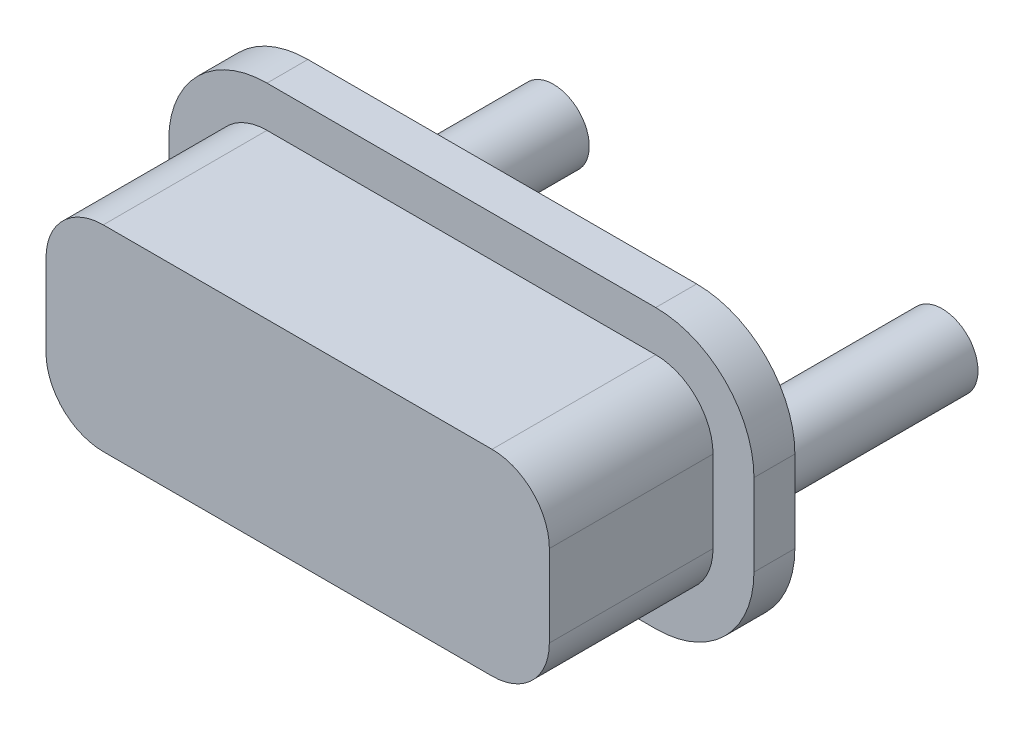
ISO-10303-21;
HEADER;
FILE_DESCRIPTION(('STEP AP214'),'2;1');
FILE_NAME('part.step','',(''),(''),'','','');
FILE_SCHEMA(('AUTOMOTIVE_DESIGN { 1 0 10303 214 1 1 1 1 }'));
ENDSEC;
DATA;
#1=APPLICATION_CONTEXT('core data for automotive mechanical design processes');
#2=APPLICATION_PROTOCOL_DEFINITION('international standard','automotive_design',2000,#1);
#3=PRODUCT_CONTEXT('',#1,'mechanical');
#4=PRODUCT('Part','Part','',(#3));
#5=PRODUCT_RELATED_PRODUCT_CATEGORY('part','',(#4));
#6=PRODUCT_DEFINITION_FORMATION('','',#4);
#7=PRODUCT_DEFINITION_CONTEXT('part definition',#1,'design');
#8=PRODUCT_DEFINITION('design','',#6,#7);
#9=PRODUCT_DEFINITION_SHAPE('','',#8);
#10=(LENGTH_UNIT() NAMED_UNIT(*) SI_UNIT(.MILLI.,.METRE.));
#11=(NAMED_UNIT(*) PLANE_ANGLE_UNIT() SI_UNIT($,.RADIAN.));
#12=(NAMED_UNIT(*) SI_UNIT($,.STERADIAN.) SOLID_ANGLE_UNIT());
#13=UNCERTAINTY_MEASURE_WITH_UNIT(LENGTH_MEASURE(1.E-05),#10,'distance_accuracy_value','');
#14=(GEOMETRIC_REPRESENTATION_CONTEXT(3) GLOBAL_UNCERTAINTY_ASSIGNED_CONTEXT((#13)) GLOBAL_UNIT_ASSIGNED_CONTEXT((#10,
#11,#12)) REPRESENTATION_CONTEXT('',''));
#15=CARTESIAN_POINT('',(0.,0.,0.));
#16=DIRECTION('',(0.,0.,1.));
#17=DIRECTION('',(1.,0.,0.));
#18=AXIS2_PLACEMENT_3D('',#15,#16,#17);
#19=CARTESIAN_POINT('',(9.49999999999998,57.365,-10.));
#20=DIRECTION('',(0.,0.,1.));
#21=DIRECTION('',(1.,0.,0.));
#22=AXIS2_PLACEMENT_3D('',#19,#20,#21);
#23=CYLINDRICAL_SURFACE('',#22,2.8);
#24=CARTESIAN_POINT('',(9.49999999999998,57.365,-8.));
#25=DIRECTION('',(0.,0.,1.));
#26=DIRECTION('',(1.,0.,0.));
#27=AXIS2_PLACEMENT_3D('',#24,#25,#26);
#28=CIRCLE('',#27,2.8);
#29=CARTESIAN_POINT('',(12.3,57.365,-8.));
#30=VERTEX_POINT('',#29);
#31=CARTESIAN_POINT('',(9.49999999999998,54.565,-8.));
#32=VERTEX_POINT('',#31);
#33=EDGE_CURVE('E200',#30,#32,#28,.F.);
#34=ORIENTED_EDGE('',*,*,#33,.F.);
#35=DIRECTION('',(0.,0.,1.));
#36=VECTOR('',#35,1.);
#37=CARTESIAN_POINT('',(12.3,57.365,-10.));
#38=LINE('',#37,#36);
#39=CARTESIAN_POINT('',(12.3,57.365,0.));
#40=VERTEX_POINT('',#39);
#41=EDGE_CURVE('E227',#30,#40,#38,.T.);
#42=ORIENTED_EDGE('',*,*,#41,.T.);
#43=CARTESIAN_POINT('',(9.49999999999998,57.365,0.));
#44=DIRECTION('',(0.,0.,1.));
#45=DIRECTION('',(1.,0.,0.));
#46=AXIS2_PLACEMENT_3D('',#43,#44,#45);
#47=CIRCLE('',#46,2.8);
#48=CARTESIAN_POINT('',(9.49999999999998,54.565,0.));
#49=VERTEX_POINT('',#48);
#50=EDGE_CURVE('E203',#49,#40,#47,.T.);
#51=ORIENTED_EDGE('',*,*,#50,.F.);
#52=DIRECTION('',(0.,0.,1.));
#53=VECTOR('',#52,1.);
#54=CARTESIAN_POINT('',(9.49999999999998,54.565,-10.));
#55=LINE('',#54,#53);
#56=EDGE_CURVE('E228',#32,#49,#55,.T.);
#57=ORIENTED_EDGE('',*,*,#56,.F.);
#58=EDGE_LOOP('',(#34,#42,#51,#57));
#59=FACE_BOUND('',#58,.T.);
#60=ADVANCED_FACE('F41',(#59),#23,.T.);
#61=CARTESIAN_POINT('',(-9.50000000000003,54.565,-10.));
#62=DIRECTION('',(0.,-1.,0.));
#63=DIRECTION('',(0.,0.,-1.));
#64=AXIS2_PLACEMENT_3D('',#61,#62,#63);
#65=PLANE('',#64);
#66=DIRECTION('',(-1.,0.,0.));
#67=VECTOR('',#66,1.);
#68=CARTESIAN_POINT('',(-9.50000000000003,54.565,-8.));
#69=LINE('',#68,#67);
#70=CARTESIAN_POINT('',(-9.50000000000003,54.565,-8.));
#71=VERTEX_POINT('',#70);
#72=EDGE_CURVE('E57',#32,#71,#69,.T.);
#73=ORIENTED_EDGE('',*,*,#72,.F.);
#74=ORIENTED_EDGE('',*,*,#56,.T.);
#75=DIRECTION('',(1.,0.,0.));
#76=VECTOR('',#75,1.);
#77=CARTESIAN_POINT('',(-9.50000000000003,54.565,0.));
#78=LINE('',#77,#76);
#79=CARTESIAN_POINT('',(-9.50000000000003,54.565,0.));
#80=VERTEX_POINT('',#79);
#81=EDGE_CURVE('E224',#80,#49,#78,.T.);
#82=ORIENTED_EDGE('',*,*,#81,.F.);
#83=DIRECTION('',(0.,0.,1.));
#84=VECTOR('',#83,1.);
#85=CARTESIAN_POINT('',(-9.50000000000003,54.565,-10.));
#86=LINE('',#85,#84);
#87=EDGE_CURVE('E231',#71,#80,#86,.T.);
#88=ORIENTED_EDGE('',*,*,#87,.F.);
#89=EDGE_LOOP('',(#73,#74,#82,#88));
#90=FACE_BOUND('',#89,.T.);
#91=ADVANCED_FACE('F353',(#90),#65,.T.);
#92=CARTESIAN_POINT('',(-9.50000000000003,57.365,-10.));
#93=DIRECTION('',(0.,0.,1.));
#94=DIRECTION('',(1.,0.,0.));
#95=AXIS2_PLACEMENT_3D('',#92,#93,#94);
#96=CYLINDRICAL_SURFACE('',#95,2.8);
#97=CARTESIAN_POINT('',(-9.50000000000003,57.365,-8.));
#98=DIRECTION('',(0.,0.,1.));
#99=DIRECTION('',(1.,0.,0.));
#100=AXIS2_PLACEMENT_3D('',#97,#98,#99);
#101=CIRCLE('',#100,2.8);
#102=CARTESIAN_POINT('',(-12.3,57.365,-8.));
#103=VERTEX_POINT('',#102);
#104=EDGE_CURVE('E65',#71,#103,#101,.F.);
#105=ORIENTED_EDGE('',*,*,#104,.F.);
#106=ORIENTED_EDGE('',*,*,#87,.T.);
#107=CARTESIAN_POINT('',(-9.50000000000003,57.365,0.));
#108=DIRECTION('',(0.,0.,1.));
#109=DIRECTION('',(1.,0.,0.));
#110=AXIS2_PLACEMENT_3D('',#107,#108,#109);
#111=CIRCLE('',#110,2.8);
#112=CARTESIAN_POINT('',(-12.3,57.365,0.));
#113=VERTEX_POINT('',#112);
#114=EDGE_CURVE('E221',#113,#80,#111,.T.);
#115=ORIENTED_EDGE('',*,*,#114,.F.);
#116=DIRECTION('',(0.,0.,1.));
#117=VECTOR('',#116,1.);
#118=CARTESIAN_POINT('',(-12.3,57.365,-10.));
#119=LINE('',#118,#117);
#120=EDGE_CURVE('E233',#103,#113,#119,.T.);
#121=ORIENTED_EDGE('',*,*,#120,.F.);
#122=EDGE_LOOP('',(#105,#106,#115,#121));
#123=FACE_BOUND('',#122,.T.);
#124=ADVANCED_FACE('F360',(#123),#96,.T.);
#125=CARTESIAN_POINT('',(-12.3,61.365,-10.));
#126=DIRECTION('',(-1.,0.,0.));
#127=DIRECTION('',(0.,0.,1.));
#128=AXIS2_PLACEMENT_3D('',#125,#126,#127);
#129=PLANE('',#128);
#130=DIRECTION('',(0.,1.,0.));
#131=VECTOR('',#130,1.);
#132=CARTESIAN_POINT('',(-12.3,61.365,-8.));
#133=LINE('',#132,#131);
#134=CARTESIAN_POINT('',(-12.3,61.365,-8.));
#135=VERTEX_POINT('',#134);
#136=EDGE_CURVE('E195',#103,#135,#133,.T.);
#137=ORIENTED_EDGE('',*,*,#136,.F.);
#138=ORIENTED_EDGE('',*,*,#120,.T.);
#139=DIRECTION('',(0.,-1.,0.));
#140=VECTOR('',#139,1.);
#141=CARTESIAN_POINT('',(-12.3,61.365,0.));
#142=LINE('',#141,#140);
#143=CARTESIAN_POINT('',(-12.3,61.365,0.));
#144=VERTEX_POINT('',#143);
#145=EDGE_CURVE('E218',#144,#113,#142,.T.);
#146=ORIENTED_EDGE('',*,*,#145,.F.);
#147=DIRECTION('',(0.,0.,1.));
#148=VECTOR('',#147,1.);
#149=CARTESIAN_POINT('',(-12.3,61.365,-10.));
#150=LINE('',#149,#148);
#151=EDGE_CURVE('E235',#135,#144,#150,.T.);
#152=ORIENTED_EDGE('',*,*,#151,.F.);
#153=EDGE_LOOP('',(#137,#138,#146,#152));
#154=FACE_BOUND('',#153,.T.);
#155=ADVANCED_FACE('F385',(#154),#129,.T.);
#156=CARTESIAN_POINT('',(-9.50000000000003,61.365,-10.));
#157=DIRECTION('',(0.,0.,1.));
#158=DIRECTION('',(1.,0.,0.));
#159=AXIS2_PLACEMENT_3D('',#156,#157,#158);
#160=CYLINDRICAL_SURFACE('',#159,2.8);
#161=CARTESIAN_POINT('',(-9.50000000000003,61.365,-8.));
#162=DIRECTION('',(0.,0.,1.));
#163=DIRECTION('',(1.,0.,0.));
#164=AXIS2_PLACEMENT_3D('',#161,#162,#163);
#165=CIRCLE('',#164,2.8);
#166=CARTESIAN_POINT('',(-9.50000000000003,64.165,-8.));
#167=VERTEX_POINT('',#166);
#168=EDGE_CURVE('E192',#135,#167,#165,.F.);
#169=ORIENTED_EDGE('',*,*,#168,.F.);
#170=ORIENTED_EDGE('',*,*,#151,.T.);
#171=CARTESIAN_POINT('',(-9.50000000000003,61.365,0.));
#172=DIRECTION('',(0.,0.,1.));
#173=DIRECTION('',(1.,0.,0.));
#174=AXIS2_PLACEMENT_3D('',#171,#172,#173);
#175=CIRCLE('',#174,2.8);
#176=CARTESIAN_POINT('',(-9.50000000000003,64.165,0.));
#177=VERTEX_POINT('',#176);
#178=EDGE_CURVE('E215',#177,#144,#175,.T.);
#179=ORIENTED_EDGE('',*,*,#178,.F.);
#180=DIRECTION('',(0.,0.,1.));
#181=VECTOR('',#180,1.);
#182=CARTESIAN_POINT('',(-9.50000000000003,64.165,-10.));
#183=LINE('',#182,#181);
#184=EDGE_CURVE('E237',#167,#177,#183,.T.);
#185=ORIENTED_EDGE('',*,*,#184,.F.);
#186=EDGE_LOOP('',(#169,#170,#179,#185));
#187=FACE_BOUND('',#186,.T.);
#188=ADVANCED_FACE('F381',(#187),#160,.T.);
#189=CARTESIAN_POINT('',(9.49999999999997,64.165,-10.));
#190=DIRECTION('',(0.,1.,0.));
#191=DIRECTION('',(0.,0.,1.));
#192=AXIS2_PLACEMENT_3D('',#189,#190,#191);
#193=PLANE('',#192);
#194=DIRECTION('',(1.,0.,0.));
#195=VECTOR('',#194,1.);
#196=CARTESIAN_POINT('',(9.49999999999997,64.165,-8.));
#197=LINE('',#196,#195);
#198=CARTESIAN_POINT('',(9.49999999999997,64.165,-8.));
#199=VERTEX_POINT('',#198);
#200=EDGE_CURVE('E184',#167,#199,#197,.T.);
#201=ORIENTED_EDGE('',*,*,#200,.F.);
#202=ORIENTED_EDGE('',*,*,#184,.T.);
#203=DIRECTION('',(-1.,0.,0.));
#204=VECTOR('',#203,1.);
#205=CARTESIAN_POINT('',(9.49999999999997,64.165,0.));
#206=LINE('',#205,#204);
#207=CARTESIAN_POINT('',(9.49999999999997,64.165,0.));
#208=VERTEX_POINT('',#207);
#209=EDGE_CURVE('E212',#208,#177,#206,.T.);
#210=ORIENTED_EDGE('',*,*,#209,.F.);
#211=DIRECTION('',(0.,0.,1.));
#212=VECTOR('',#211,1.);
#213=CARTESIAN_POINT('',(9.49999999999997,64.165,-10.));
#214=LINE('',#213,#212);
#215=EDGE_CURVE('E239',#199,#208,#214,.T.);
#216=ORIENTED_EDGE('',*,*,#215,.F.);
#217=EDGE_LOOP('',(#201,#202,#210,#216));
#218=FACE_BOUND('',#217,.T.);
#219=ADVANCED_FACE('F377',(#218),#193,.T.);
#220=CARTESIAN_POINT('',(9.49999999999998,61.365,-10.));
#221=DIRECTION('',(0.,0.,1.));
#222=DIRECTION('',(1.,0.,0.));
#223=AXIS2_PLACEMENT_3D('',#220,#221,#222);
#224=CYLINDRICAL_SURFACE('',#223,2.8);
#225=CARTESIAN_POINT('',(9.49999999999998,61.365,-8.));
#226=DIRECTION('',(0.,0.,1.));
#227=DIRECTION('',(1.,0.,0.));
#228=AXIS2_PLACEMENT_3D('',#225,#226,#227);
#229=CIRCLE('',#228,2.8);
#230=CARTESIAN_POINT('',(12.3,61.365,-8.));
#231=VERTEX_POINT('',#230);
#232=EDGE_CURVE('E181',#199,#231,#229,.F.);
#233=ORIENTED_EDGE('',*,*,#232,.F.);
#234=ORIENTED_EDGE('',*,*,#215,.T.);
#235=CARTESIAN_POINT('',(9.49999999999998,61.365,0.));
#236=DIRECTION('',(0.,0.,1.));
#237=DIRECTION('',(1.,0.,0.));
#238=AXIS2_PLACEMENT_3D('',#235,#236,#237);
#239=CIRCLE('',#238,2.8);
#240=CARTESIAN_POINT('',(12.3,61.365,0.));
#241=VERTEX_POINT('',#240);
#242=EDGE_CURVE('E209',#241,#208,#239,.T.);
#243=ORIENTED_EDGE('',*,*,#242,.F.);
#244=DIRECTION('',(0.,0.,1.));
#245=VECTOR('',#244,1.);
#246=CARTESIAN_POINT('',(12.3,61.365,-10.));
#247=LINE('',#246,#245);
#248=EDGE_CURVE('E241',#231,#241,#247,.T.);
#249=ORIENTED_EDGE('',*,*,#248,.F.);
#250=EDGE_LOOP('',(#233,#234,#243,#249));
#251=FACE_BOUND('',#250,.T.);
#252=ADVANCED_FACE('F373',(#251),#224,.T.);
#253=CARTESIAN_POINT('',(12.3,57.365,-10.));
#254=DIRECTION('',(1.,0.,0.));
#255=DIRECTION('',(0.,0.,-1.));
#256=AXIS2_PLACEMENT_3D('',#253,#254,#255);
#257=PLANE('',#256);
#258=DIRECTION('',(0.,-1.,0.));
#259=VECTOR('',#258,1.);
#260=CARTESIAN_POINT('',(12.3,57.365,-8.));
#261=LINE('',#260,#259);
#262=EDGE_CURVE('E230',#231,#30,#261,.T.);
#263=ORIENTED_EDGE('',*,*,#262,.F.);
#264=ORIENTED_EDGE('',*,*,#248,.T.);
#265=DIRECTION('',(0.,1.,0.));
#266=VECTOR('',#265,1.);
#267=CARTESIAN_POINT('',(12.3,57.365,0.));
#268=LINE('',#267,#266);
#269=EDGE_CURVE('E206',#40,#241,#268,.T.);
#270=ORIENTED_EDGE('',*,*,#269,.F.);
#271=ORIENTED_EDGE('',*,*,#41,.F.);
#272=EDGE_LOOP('',(#263,#264,#270,#271));
#273=FACE_BOUND('',#272,.T.);
#274=ADVANCED_FACE('F364',(#273),#257,.T.);
#275=CARTESIAN_POINT('',(9.49999999999998,57.365,0.));
#276=DIRECTION('',(0.,0.,1.));
#277=DIRECTION('',(1.,0.,0.));
#278=AXIS2_PLACEMENT_3D('',#275,#276,#277);
#279=PLANE('',#278);
#280=ORIENTED_EDGE('',*,*,#50,.T.);
#281=ORIENTED_EDGE('',*,*,#269,.T.);
#282=ORIENTED_EDGE('',*,*,#242,.T.);
#283=ORIENTED_EDGE('',*,*,#209,.T.);
#284=ORIENTED_EDGE('',*,*,#178,.T.);
#285=ORIENTED_EDGE('',*,*,#145,.T.);
#286=ORIENTED_EDGE('',*,*,#114,.T.);
#287=ORIENTED_EDGE('',*,*,#81,.T.);
#288=EDGE_LOOP('',(#280,#281,#282,#283,#284,#285,#286,#287));
#289=FACE_BOUND('',#288,.T.);
#290=ADVANCED_FACE('F372',(#289),#279,.T.);
#291=CARTESIAN_POINT('',(-9.50000000000003,57.365,-8.));
#292=DIRECTION('',(0.,0.,-1.));
#293=DIRECTION('',(-1.,0.,0.));
#294=AXIS2_PLACEMENT_3D('',#291,#292,#293);
#295=CYLINDRICAL_SURFACE('',#294,4.80000000000001);
#296=CARTESIAN_POINT('',(-9.50000000000003,57.365,-10.));
#297=DIRECTION('',(0.,0.,1.));
#298=DIRECTION('',(1.,0.,0.));
#299=AXIS2_PLACEMENT_3D('',#296,#297,#298);
#300=CIRCLE('',#299,4.80000000000001);
#301=CARTESIAN_POINT('',(-14.3,57.365,-10.));
#302=VERTEX_POINT('',#301);
#303=CARTESIAN_POINT('',(-9.50000000000003,52.565,-10.));
#304=VERTEX_POINT('',#303);
#305=EDGE_CURVE('E180',#302,#304,#300,.T.);
#306=ORIENTED_EDGE('',*,*,#305,.T.);
#307=DIRECTION('',(0.,0.,-1.));
#308=VECTOR('',#307,1.);
#309=CARTESIAN_POINT('',(-9.50000000000003,52.565,-8.));
#310=LINE('',#309,#308);
#311=CARTESIAN_POINT('',(-9.50000000000003,52.565,-8.));
#312=VERTEX_POINT('',#311);
#313=EDGE_CURVE('E160',#312,#304,#310,.T.);
#314=ORIENTED_EDGE('',*,*,#313,.F.);
#315=CARTESIAN_POINT('',(-9.50000000000003,57.365,-8.));
#316=DIRECTION('',(0.,0.,1.));
#317=DIRECTION('',(1.,0.,0.));
#318=AXIS2_PLACEMENT_3D('',#315,#316,#317);
#319=CIRCLE('',#318,4.80000000000001);
#320=CARTESIAN_POINT('',(-14.3,57.365,-8.));
#321=VERTEX_POINT('',#320);
#322=EDGE_CURVE('E167',#321,#312,#319,.T.);
#323=ORIENTED_EDGE('',*,*,#322,.F.);
#324=DIRECTION('',(0.,0.,-1.));
#325=VECTOR('',#324,1.);
#326=CARTESIAN_POINT('',(-14.3,57.365,-8.));
#327=LINE('',#326,#325);
#328=EDGE_CURVE('E294',#321,#302,#327,.T.);
#329=ORIENTED_EDGE('',*,*,#328,.T.);
#330=EDGE_LOOP('',(#306,#314,#323,#329));
#331=FACE_BOUND('',#330,.T.);
#332=ADVANCED_FACE('F178',(#331),#295,.T.);
#333=CARTESIAN_POINT('',(9.49999999999998,52.565,-8.));
#334=DIRECTION('',(0.,1.,0.));
#335=DIRECTION('',(0.,0.,1.));
#336=AXIS2_PLACEMENT_3D('',#333,#334,#335);
#337=PLANE('',#336);
#338=DIRECTION('',(1.,0.,0.));
#339=VECTOR('',#338,1.);
#340=CARTESIAN_POINT('',(9.49999999999998,52.565,-10.));
#341=LINE('',#340,#339);
#342=CARTESIAN_POINT('',(9.49999999999998,52.565,-10.));
#343=VERTEX_POINT('',#342);
#344=EDGE_CURVE('E273',#304,#343,#341,.T.);
#345=ORIENTED_EDGE('',*,*,#344,.T.);
#346=DIRECTION('',(0.,0.,-1.));
#347=VECTOR('',#346,1.);
#348=CARTESIAN_POINT('',(9.49999999999998,52.565,-8.));
#349=LINE('',#348,#347);
#350=CARTESIAN_POINT('',(9.49999999999998,52.565,-8.));
#351=VERTEX_POINT('',#350);
#352=EDGE_CURVE('E163',#351,#343,#349,.T.);
#353=ORIENTED_EDGE('',*,*,#352,.F.);
#354=DIRECTION('',(1.,0.,0.));
#355=VECTOR('',#354,1.);
#356=CARTESIAN_POINT('',(9.49999999999998,52.565,-8.));
#357=LINE('',#356,#355);
#358=EDGE_CURVE('E156',#312,#351,#357,.T.);
#359=ORIENTED_EDGE('',*,*,#358,.F.);
#360=ORIENTED_EDGE('',*,*,#313,.T.);
#361=EDGE_LOOP('',(#345,#353,#359,#360));
#362=FACE_BOUND('',#361,.T.);
#363=ADVANCED_FACE('F158',(#362),#337,.F.);
#364=CARTESIAN_POINT('',(9.49999999999998,57.365,-8.));
#365=DIRECTION('',(0.,0.,-1.));
#366=DIRECTION('',(-1.,0.,0.));
#367=AXIS2_PLACEMENT_3D('',#364,#365,#366);
#368=CYLINDRICAL_SURFACE('',#367,4.8);
#369=CARTESIAN_POINT('',(9.49999999999998,57.365,-10.));
#370=DIRECTION('',(0.,0.,1.));
#371=DIRECTION('',(1.,0.,0.));
#372=AXIS2_PLACEMENT_3D('',#369,#370,#371);
#373=CIRCLE('',#372,4.8);
#374=CARTESIAN_POINT('',(14.3,57.365,-10.));
#375=VERTEX_POINT('',#374);
#376=EDGE_CURVE('E276',#343,#375,#373,.T.);
#377=ORIENTED_EDGE('',*,*,#376,.T.);
#378=DIRECTION('',(0.,0.,-1.));
#379=VECTOR('',#378,1.);
#380=CARTESIAN_POINT('',(14.3,57.365,-8.));
#381=LINE('',#380,#379);
#382=CARTESIAN_POINT('',(14.3,57.365,-8.));
#383=VERTEX_POINT('',#382);
#384=EDGE_CURVE('E186',#383,#375,#381,.T.);
#385=ORIENTED_EDGE('',*,*,#384,.F.);
#386=CARTESIAN_POINT('',(9.49999999999998,57.365,-8.));
#387=DIRECTION('',(0.,0.,1.));
#388=DIRECTION('',(1.,0.,0.));
#389=AXIS2_PLACEMENT_3D('',#386,#387,#388);
#390=CIRCLE('',#389,4.8);
#391=EDGE_CURVE('E166',#351,#383,#390,.T.);
#392=ORIENTED_EDGE('',*,*,#391,.F.);
#393=ORIENTED_EDGE('',*,*,#352,.T.);
#394=EDGE_LOOP('',(#377,#385,#392,#393));
#395=FACE_BOUND('',#394,.T.);
#396=ADVANCED_FACE('F398',(#395),#368,.T.);
#397=CARTESIAN_POINT('',(14.3,57.365,-8.));
#398=DIRECTION('',(-1.,0.,0.));
#399=DIRECTION('',(0.,-1.,0.));
#400=AXIS2_PLACEMENT_3D('',#397,#398,#399);
#401=PLANE('',#400);
#402=DIRECTION('',(0.,1.,0.));
#403=VECTOR('',#402,1.);
#404=CARTESIAN_POINT('',(14.3,57.365,-10.));
#405=LINE('',#404,#403);
#406=CARTESIAN_POINT('',(14.3,61.365,-10.));
#407=VERTEX_POINT('',#406);
#408=EDGE_CURVE('E285',#375,#407,#405,.T.);
#409=ORIENTED_EDGE('',*,*,#408,.T.);
#410=DIRECTION('',(0.,0.,-1.));
#411=VECTOR('',#410,1.);
#412=CARTESIAN_POINT('',(14.3,61.365,-8.));
#413=LINE('',#412,#411);
#414=CARTESIAN_POINT('',(14.3,61.365,-8.));
#415=VERTEX_POINT('',#414);
#416=EDGE_CURVE('E305',#415,#407,#413,.T.);
#417=ORIENTED_EDGE('',*,*,#416,.F.);
#418=DIRECTION('',(0.,1.,0.));
#419=VECTOR('',#418,1.);
#420=CARTESIAN_POINT('',(14.3,57.365,-8.));
#421=LINE('',#420,#419);
#422=EDGE_CURVE('E314',#383,#415,#421,.T.);
#423=ORIENTED_EDGE('',*,*,#422,.F.);
#424=ORIENTED_EDGE('',*,*,#384,.T.);
#425=EDGE_LOOP('',(#409,#417,#423,#424));
#426=FACE_BOUND('',#425,.T.);
#427=ADVANCED_FACE('F312',(#426),#401,.F.);
#428=CARTESIAN_POINT('',(9.49999999999998,61.365,-8.));
#429=DIRECTION('',(0.,0.,-1.));
#430=DIRECTION('',(-1.,0.,0.));
#431=AXIS2_PLACEMENT_3D('',#428,#429,#430);
#432=CYLINDRICAL_SURFACE('',#431,4.8);
#433=CARTESIAN_POINT('',(9.49999999999998,61.365,-10.));
#434=DIRECTION('',(0.,0.,1.));
#435=DIRECTION('',(1.,0.,0.));
#436=AXIS2_PLACEMENT_3D('',#433,#434,#435);
#437=CIRCLE('',#436,4.8);
#438=CARTESIAN_POINT('',(9.49999999999997,66.165,-10.));
#439=VERTEX_POINT('',#438);
#440=EDGE_CURVE('E287',#407,#439,#437,.T.);
#441=ORIENTED_EDGE('',*,*,#440,.T.);
#442=DIRECTION('',(0.,0.,-1.));
#443=VECTOR('',#442,1.);
#444=CARTESIAN_POINT('',(9.49999999999997,66.165,-8.));
#445=LINE('',#444,#443);
#446=CARTESIAN_POINT('',(9.49999999999997,66.165,-8.));
#447=VERTEX_POINT('',#446);
#448=EDGE_CURVE('E302',#447,#439,#445,.T.);
#449=ORIENTED_EDGE('',*,*,#448,.F.);
#450=CARTESIAN_POINT('',(9.49999999999998,61.365,-8.));
#451=DIRECTION('',(0.,0.,1.));
#452=DIRECTION('',(1.,0.,0.));
#453=AXIS2_PLACEMENT_3D('',#450,#451,#452);
#454=CIRCLE('',#453,4.8);
#455=EDGE_CURVE('E329',#415,#447,#454,.T.);
#456=ORIENTED_EDGE('',*,*,#455,.F.);
#457=ORIENTED_EDGE('',*,*,#416,.T.);
#458=EDGE_LOOP('',(#441,#449,#456,#457));
#459=FACE_BOUND('',#458,.T.);
#460=ADVANCED_FACE('F320',(#459),#432,.T.);
#461=CARTESIAN_POINT('',(9.49999999999998,66.165,-8.));
#462=DIRECTION('',(0.,-1.,0.));
#463=DIRECTION('',(0.,0.,-1.));
#464=AXIS2_PLACEMENT_3D('',#461,#462,#463);
#465=PLANE('',#464);
#466=DIRECTION('',(-1.,0.,0.));
#467=VECTOR('',#466,1.);
#468=CARTESIAN_POINT('',(9.49999999999998,66.165,-10.));
#469=LINE('',#468,#467);
#470=CARTESIAN_POINT('',(-9.50000000000003,66.165,-10.));
#471=VERTEX_POINT('',#470);
#472=EDGE_CURVE('E289',#439,#471,#469,.T.);
#473=ORIENTED_EDGE('',*,*,#472,.T.);
#474=DIRECTION('',(0.,0.,-1.));
#475=VECTOR('',#474,1.);
#476=CARTESIAN_POINT('',(-9.50000000000003,66.165,-8.));
#477=LINE('',#476,#475);
#478=CARTESIAN_POINT('',(-9.50000000000003,66.165,-8.));
#479=VERTEX_POINT('',#478);
#480=EDGE_CURVE('E299',#479,#471,#477,.T.);
#481=ORIENTED_EDGE('',*,*,#480,.F.);
#482=DIRECTION('',(-1.,0.,0.));
#483=VECTOR('',#482,1.);
#484=CARTESIAN_POINT('',(9.49999999999998,66.165,-8.));
#485=LINE('',#484,#483);
#486=EDGE_CURVE('E326',#447,#479,#485,.T.);
#487=ORIENTED_EDGE('',*,*,#486,.F.);
#488=ORIENTED_EDGE('',*,*,#448,.T.);
#489=EDGE_LOOP('',(#473,#481,#487,#488));
#490=FACE_BOUND('',#489,.T.);
#491=ADVANCED_FACE('F324',(#490),#465,.F.);
#492=CARTESIAN_POINT('',(-9.50000000000003,61.365,-8.));
#493=DIRECTION('',(0.,0.,-1.));
#494=DIRECTION('',(-1.,0.,0.));
#495=AXIS2_PLACEMENT_3D('',#492,#493,#494);
#496=CYLINDRICAL_SURFACE('',#495,4.8);
#497=CARTESIAN_POINT('',(-9.50000000000003,61.365,-10.));
#498=DIRECTION('',(0.,0.,1.));
#499=DIRECTION('',(1.,0.,0.));
#500=AXIS2_PLACEMENT_3D('',#497,#498,#499);
#501=CIRCLE('',#500,4.8);
#502=CARTESIAN_POINT('',(-14.3,61.365,-10.));
#503=VERTEX_POINT('',#502);
#504=EDGE_CURVE('E291',#471,#503,#501,.T.);
#505=ORIENTED_EDGE('',*,*,#504,.T.);
#506=DIRECTION('',(0.,0.,-1.));
#507=VECTOR('',#506,1.);
#508=CARTESIAN_POINT('',(-14.3,61.365,-8.));
#509=LINE('',#508,#507);
#510=CARTESIAN_POINT('',(-14.3,61.365,-8.));
#511=VERTEX_POINT('',#510);
#512=EDGE_CURVE('E296',#511,#503,#509,.T.);
#513=ORIENTED_EDGE('',*,*,#512,.F.);
#514=CARTESIAN_POINT('',(-9.50000000000003,61.365,-8.));
#515=DIRECTION('',(0.,0.,1.));
#516=DIRECTION('',(1.,0.,0.));
#517=AXIS2_PLACEMENT_3D('',#514,#515,#516);
#518=CIRCLE('',#517,4.8);
#519=EDGE_CURVE('E328',#479,#511,#518,.T.);
#520=ORIENTED_EDGE('',*,*,#519,.F.);
#521=ORIENTED_EDGE('',*,*,#480,.T.);
#522=EDGE_LOOP('',(#505,#513,#520,#521));
#523=FACE_BOUND('',#522,.T.);
#524=ADVANCED_FACE('F407',(#523),#496,.T.);
#525=CARTESIAN_POINT('',(-14.3,57.365,-8.));
#526=DIRECTION('',(1.,0.,0.));
#527=DIRECTION('',(0.,1.,0.));
#528=AXIS2_PLACEMENT_3D('',#525,#526,#527);
#529=PLANE('',#528);
#530=DIRECTION('',(0.,-1.,0.));
#531=VECTOR('',#530,1.);
#532=CARTESIAN_POINT('',(-14.3,57.365,-10.));
#533=LINE('',#532,#531);
#534=EDGE_CURVE('E176',#503,#302,#533,.T.);
#535=ORIENTED_EDGE('',*,*,#534,.T.);
#536=ORIENTED_EDGE('',*,*,#328,.F.);
#537=DIRECTION('',(0.,-1.,0.));
#538=VECTOR('',#537,1.);
#539=CARTESIAN_POINT('',(-14.3,57.365,-8.));
#540=LINE('',#539,#538);
#541=EDGE_CURVE('E172',#511,#321,#540,.T.);
#542=ORIENTED_EDGE('',*,*,#541,.F.);
#543=ORIENTED_EDGE('',*,*,#512,.T.);
#544=EDGE_LOOP('',(#535,#536,#542,#543));
#545=FACE_BOUND('',#544,.T.);
#546=ADVANCED_FACE('F410',(#545),#529,.F.);
#547=CARTESIAN_POINT('',(-9.50000000000003,57.365,-8.));
#548=DIRECTION('',(0.,0.,1.));
#549=DIRECTION('',(1.,0.,0.));
#550=AXIS2_PLACEMENT_3D('',#547,#548,#549);
#551=PLANE('',#550);
#552=ORIENTED_EDGE('',*,*,#262,.T.);
#553=ORIENTED_EDGE('',*,*,#33,.T.);
#554=ORIENTED_EDGE('',*,*,#72,.T.);
#555=ORIENTED_EDGE('',*,*,#104,.T.);
#556=ORIENTED_EDGE('',*,*,#136,.T.);
#557=ORIENTED_EDGE('',*,*,#168,.T.);
#558=ORIENTED_EDGE('',*,*,#200,.T.);
#559=ORIENTED_EDGE('',*,*,#232,.T.);
#560=EDGE_LOOP('',(#552,#553,#554,#555,#556,#557,#558,#559));
#561=FACE_BOUND('',#560,.T.);
#562=ORIENTED_EDGE('',*,*,#322,.T.);
#563=ORIENTED_EDGE('',*,*,#358,.T.);
#564=ORIENTED_EDGE('',*,*,#391,.T.);
#565=ORIENTED_EDGE('',*,*,#422,.T.);
#566=ORIENTED_EDGE('',*,*,#455,.T.);
#567=ORIENTED_EDGE('',*,*,#486,.T.);
#568=ORIENTED_EDGE('',*,*,#519,.T.);
#569=ORIENTED_EDGE('',*,*,#541,.T.);
#570=EDGE_LOOP('',(#562,#563,#564,#565,#566,#567,#568,#569));
#571=FACE_BOUND('',#570,.T.);
#572=ADVANCED_FACE('F170',(#561,#571),#551,.T.);
#573=CARTESIAN_POINT('',(9.49999999999998,57.365,-10.));
#574=DIRECTION('',(0.,0.,1.));
#575=DIRECTION('',(1.,0.,0.));
#576=AXIS2_PLACEMENT_3D('',#573,#574,#575);
#577=PLANE('',#576);
#578=CARTESIAN_POINT('',(9.49999999999998,57.365,-10.));
#579=DIRECTION('',(0.,0.,1.));
#580=DIRECTION('',(1.,0.,0.));
#581=AXIS2_PLACEMENT_3D('',#578,#579,#580);
#582=CIRCLE('',#581,2.75);
#583=CARTESIAN_POINT('',(12.25,57.365,-10.));
#584=VERTEX_POINT('',#583);
#585=EDGE_CURVE('E249',#584,#584,#582,.T.);
#586=ORIENTED_EDGE('',*,*,#585,.T.);
#587=EDGE_LOOP('',(#586));
#588=FACE_BOUND('',#587,.T.);
#589=CARTESIAN_POINT('',(-9.50000000000003,57.365,-10.));
#590=DIRECTION('',(0.,0.,1.));
#591=DIRECTION('',(1.,0.,0.));
#592=AXIS2_PLACEMENT_3D('',#589,#590,#591);
#593=CIRCLE('',#592,2.75);
#594=CARTESIAN_POINT('',(-6.75000000000002,57.365,-10.));
#595=VERTEX_POINT('',#594);
#596=EDGE_CURVE('E246',#595,#595,#593,.T.);
#597=ORIENTED_EDGE('',*,*,#596,.T.);
#598=EDGE_LOOP('',(#597));
#599=FACE_BOUND('',#598,.T.);
#600=ORIENTED_EDGE('',*,*,#305,.F.);
#601=ORIENTED_EDGE('',*,*,#534,.F.);
#602=ORIENTED_EDGE('',*,*,#504,.F.);
#603=ORIENTED_EDGE('',*,*,#472,.F.);
#604=ORIENTED_EDGE('',*,*,#440,.F.);
#605=ORIENTED_EDGE('',*,*,#408,.F.);
#606=ORIENTED_EDGE('',*,*,#376,.F.);
#607=ORIENTED_EDGE('',*,*,#344,.F.);
#608=EDGE_LOOP('',(#600,#601,#602,#603,#604,#605,#606,#607));
#609=FACE_BOUND('',#608,.T.);
#610=ADVANCED_FACE('F263',(#588,#599,#609),#577,.F.);
#611=CARTESIAN_POINT('',(-9.50000000000003,57.365,-22.));
#612=DIRECTION('',(0.,0.,1.));
#613=DIRECTION('',(1.,0.,0.));
#614=AXIS2_PLACEMENT_3D('',#611,#612,#613);
#615=CYLINDRICAL_SURFACE('',#614,1.75);
#616=CARTESIAN_POINT('',(-9.50000000000003,57.365,-11.));
#617=DIRECTION('',(0.,0.,1.));
#618=DIRECTION('',(1.,0.,0.));
#619=AXIS2_PLACEMENT_3D('',#616,#617,#618);
#620=CIRCLE('',#619,1.75);
#621=CARTESIAN_POINT('',(-7.75000000000002,57.365,-11.));
#622=VERTEX_POINT('',#621);
#623=EDGE_CURVE('E11',#622,#622,#620,.F.);
#624=ORIENTED_EDGE('',*,*,#623,.T.);
#625=EDGE_LOOP('',(#624));
#626=FACE_BOUND('',#625,.T.);
#627=CARTESIAN_POINT('',(-9.50000000000003,57.365,-22.));
#628=DIRECTION('',(0.,0.,1.));
#629=DIRECTION('',(1.,0.,0.));
#630=AXIS2_PLACEMENT_3D('',#627,#628,#629);
#631=CIRCLE('',#630,1.75);
#632=CARTESIAN_POINT('',(-7.75000000000002,57.365,-22.));
#633=VERTEX_POINT('',#632);
#634=EDGE_CURVE('E279',#633,#633,#631,.T.);
#635=ORIENTED_EDGE('',*,*,#634,.T.);
#636=EDGE_LOOP('',(#635));
#637=FACE_BOUND('',#636,.T.);
#638=ADVANCED_FACE('F266',(#626,#637),#615,.T.);
#639=CARTESIAN_POINT('',(-9.50000000000003,57.365,-22.));
#640=DIRECTION('',(0.,0.,1.));
#641=DIRECTION('',(1.,0.,0.));
#642=AXIS2_PLACEMENT_3D('',#639,#640,#641);
#643=PLANE('',#642);
#644=ORIENTED_EDGE('',*,*,#634,.F.);
#645=EDGE_LOOP('',(#644));
#646=FACE_BOUND('',#645,.T.);
#647=ADVANCED_FACE('F339',(#646),#643,.F.);
#648=CARTESIAN_POINT('',(9.49999999999998,57.365,-22.));
#649=DIRECTION('',(0.,0.,1.));
#650=DIRECTION('',(1.,0.,0.));
#651=AXIS2_PLACEMENT_3D('',#648,#649,#650);
#652=CYLINDRICAL_SURFACE('',#651,1.75);
#653=CARTESIAN_POINT('',(9.49999999999998,57.365,-11.));
#654=DIRECTION('',(0.,0.,1.));
#655=DIRECTION('',(1.,0.,0.));
#656=AXIS2_PLACEMENT_3D('',#653,#654,#655);
#657=CIRCLE('',#656,1.75);
#658=CARTESIAN_POINT('',(11.25,57.365,-11.));
#659=VERTEX_POINT('',#658);
#660=EDGE_CURVE('E50',#659,#659,#657,.F.);
#661=ORIENTED_EDGE('',*,*,#660,.T.);
#662=EDGE_LOOP('',(#661));
#663=FACE_BOUND('',#662,.T.);
#664=CARTESIAN_POINT('',(9.49999999999998,57.365,-22.));
#665=DIRECTION('',(0.,0.,1.));
#666=DIRECTION('',(1.,0.,0.));
#667=AXIS2_PLACEMENT_3D('',#664,#665,#666);
#668=CIRCLE('',#667,1.75);
#669=CARTESIAN_POINT('',(11.25,57.365,-22.));
#670=VERTEX_POINT('',#669);
#671=EDGE_CURVE('E274',#670,#670,#668,.T.);
#672=ORIENTED_EDGE('',*,*,#671,.T.);
#673=EDGE_LOOP('',(#672));
#674=FACE_BOUND('',#673,.T.);
#675=ADVANCED_FACE('F254',(#663,#674),#652,.T.);
#676=CARTESIAN_POINT('',(9.49999999999998,57.365,-22.));
#677=DIRECTION('',(0.,0.,1.));
#678=DIRECTION('',(1.,0.,0.));
#679=AXIS2_PLACEMENT_3D('',#676,#677,#678);
#680=PLANE('',#679);
#681=ORIENTED_EDGE('',*,*,#671,.F.);
#682=EDGE_LOOP('',(#681));
#683=FACE_BOUND('',#682,.T.);
#684=ADVANCED_FACE('F260',(#683),#680,.F.);
#685=CARTESIAN_POINT('',(9.49999999999998,57.365,-10.));
#686=DIRECTION('',(0.,0.,1.));
#687=DIRECTION('',(1.,0.,0.));
#688=AXIS2_PLACEMENT_3D('',#685,#686,#687);
#689=CONICAL_SURFACE('',#688,2.75,0.785398163397455);
#690=ORIENTED_EDGE('',*,*,#660,.F.);
#691=EDGE_LOOP('',(#690));
#692=FACE_BOUND('',#691,.T.);
#693=ORIENTED_EDGE('',*,*,#585,.F.);
#694=EDGE_LOOP('',(#693));
#695=FACE_BOUND('',#694,.T.);
#696=ADVANCED_FACE('F257',(#692,#695),#689,.T.);
#697=CARTESIAN_POINT('',(-9.50000000000003,57.365,-10.));
#698=DIRECTION('',(0.,0.,1.));
#699=DIRECTION('',(1.,0.,0.));
#700=AXIS2_PLACEMENT_3D('',#697,#698,#699);
#701=CONICAL_SURFACE('',#700,2.75,0.785398163397455);
#702=ORIENTED_EDGE('',*,*,#623,.F.);
#703=EDGE_LOOP('',(#702));
#704=FACE_BOUND('',#703,.T.);
#705=ORIENTED_EDGE('',*,*,#596,.F.);
#706=EDGE_LOOP('',(#705));
#707=FACE_BOUND('',#706,.T.);
#708=ADVANCED_FACE('F44',(#704,#707),#701,.T.);
#709=CLOSED_SHELL('',(#60,#91,#124,#155,#188,#219,#252,#274,#290,#332,#363,#396,#427,#460,#491,
#524,#546,#572,#610,#638,#647,#675,#684,#696,#708));
#710=MANIFOLD_SOLID_BREP('B2',#709);
#711=ADVANCED_BREP_SHAPE_REPRESENTATION('',(#18,#710),#14);
#712=SHAPE_DEFINITION_REPRESENTATION(#9,#711);
ENDSEC;
END-ISO-10303-21;
